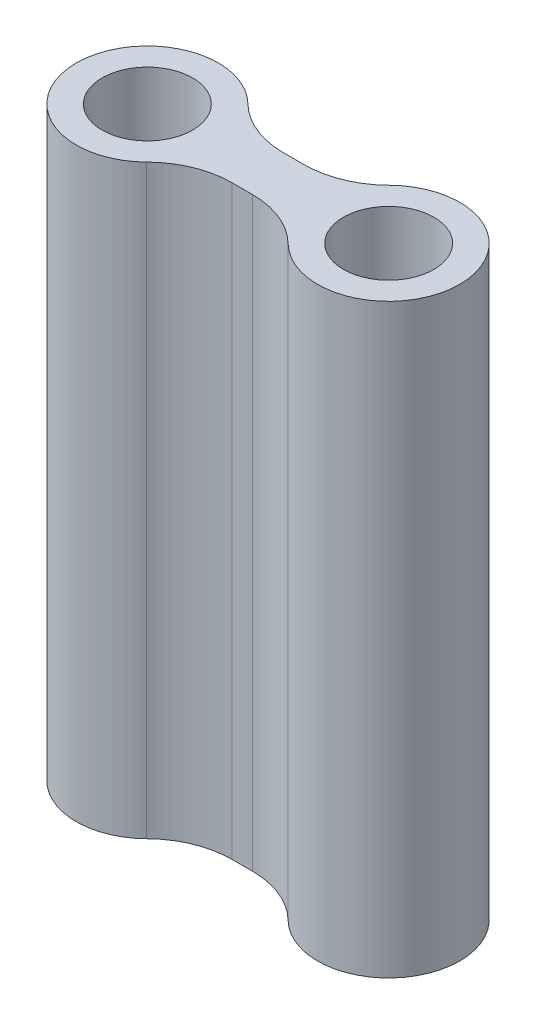
ISO-10303-21;
HEADER;
FILE_DESCRIPTION(('STEP AP214'),'2;1');
FILE_NAME('part.step','',(''),(''),'','','');
FILE_SCHEMA(('AUTOMOTIVE_DESIGN { 1 0 10303 214 1 1 1 1 }'));
ENDSEC;
DATA;
#1=APPLICATION_CONTEXT('core data for automotive mechanical design processes');
#2=APPLICATION_PROTOCOL_DEFINITION('international standard','automotive_design',2000,#1);
#3=PRODUCT_CONTEXT('',#1,'mechanical');
#4=PRODUCT('Part','Part','',(#3));
#5=PRODUCT_RELATED_PRODUCT_CATEGORY('part','',(#4));
#6=PRODUCT_DEFINITION_FORMATION('','',#4);
#7=PRODUCT_DEFINITION_CONTEXT('part definition',#1,'design');
#8=PRODUCT_DEFINITION('design','',#6,#7);
#9=PRODUCT_DEFINITION_SHAPE('','',#8);
#10=(LENGTH_UNIT() NAMED_UNIT(*) SI_UNIT(.MILLI.,.METRE.));
#11=(NAMED_UNIT(*) PLANE_ANGLE_UNIT() SI_UNIT($,.RADIAN.));
#12=(NAMED_UNIT(*) SI_UNIT($,.STERADIAN.) SOLID_ANGLE_UNIT());
#13=UNCERTAINTY_MEASURE_WITH_UNIT(LENGTH_MEASURE(1.E-05),#10,'distance_accuracy_value','');
#14=(GEOMETRIC_REPRESENTATION_CONTEXT(3) GLOBAL_UNCERTAINTY_ASSIGNED_CONTEXT((#13)) GLOBAL_UNIT_ASSIGNED_CONTEXT((#10,
#11,#12)) REPRESENTATION_CONTEXT('',''));
#15=CARTESIAN_POINT('',(0.,0.,0.));
#16=DIRECTION('',(0.,0.,1.));
#17=DIRECTION('',(1.,0.,0.));
#18=AXIS2_PLACEMENT_3D('',#15,#16,#17);
#19=CARTESIAN_POINT('',(-6.40434422872475,34.,6.5));
#20=DIRECTION('',(0.,-1.,0.));
#21=DIRECTION('',(0.,0.,-1.));
#22=AXIS2_PLACEMENT_3D('',#19,#20,#21);
#23=PLANE('',#22);
#24=CARTESIAN_POINT('',(-6.40434422872475,34.,6.5));
#25=DIRECTION('',(0.,-1.,0.));
#26=DIRECTION('',(0.,0.,-1.));
#27=AXIS2_PLACEMENT_3D('',#24,#25,#26);
#28=CIRCLE('',#27,5.);
#29=CARTESIAN_POINT('',(-6.40434422872475,34.,1.5));
#30=VERTEX_POINT('',#29);
#31=CARTESIAN_POINT('',(-2.89511451435503,34.,2.93835616438356));
#32=VERTEX_POINT('',#31);
#33=EDGE_CURVE('E145',#30,#32,#28,.T.);
#34=ORIENTED_EDGE('',*,*,#33,.T.);
#35=CARTESIAN_POINT('',(0.,34.,0.));
#36=DIRECTION('',(0.,1.,0.));
#37=DIRECTION('',(0.,0.,1.));
#38=AXIS2_PLACEMENT_3D('',#35,#36,#37);
#39=CIRCLE('',#38,4.125);
#40=CARTESIAN_POINT('',(-2.89511451435502,34.,-2.93835616438356));
#41=VERTEX_POINT('',#40);
#42=EDGE_CURVE('E93',#32,#41,#39,.T.);
#43=ORIENTED_EDGE('',*,*,#42,.T.);
#44=CARTESIAN_POINT('',(-6.40434422872475,34.,-6.5));
#45=DIRECTION('',(0.,-1.,0.));
#46=DIRECTION('',(0.,0.,1.));
#47=AXIS2_PLACEMENT_3D('',#44,#45,#46);
#48=CIRCLE('',#47,5.);
#49=CARTESIAN_POINT('',(-6.40434422872475,34.,-1.5));
#50=VERTEX_POINT('',#49);
#51=EDGE_CURVE('E160',#41,#50,#48,.T.);
#52=ORIENTED_EDGE('',*,*,#51,.T.);
#53=DIRECTION('',(-1.,0.,0.));
#54=VECTOR('',#53,1.);
#55=CARTESIAN_POINT('',(-7.59565577127525,34.,-1.5));
#56=LINE('',#55,#54);
#57=CARTESIAN_POINT('',(-7.59565577127525,34.,-1.5));
#58=VERTEX_POINT('',#57);
#59=EDGE_CURVE('E173',#50,#58,#56,.T.);
#60=ORIENTED_EDGE('',*,*,#59,.T.);
#61=CARTESIAN_POINT('',(-7.59565577127525,34.,-6.5));
#62=DIRECTION('',(0.,-1.,0.));
#63=DIRECTION('',(0.,0.,-1.));
#64=AXIS2_PLACEMENT_3D('',#61,#62,#63);
#65=CIRCLE('',#64,5.);
#66=CARTESIAN_POINT('',(-11.104885485645,34.,-2.93835616438356));
#67=VERTEX_POINT('',#66);
#68=EDGE_CURVE('E112',#58,#67,#65,.T.);
#69=ORIENTED_EDGE('',*,*,#68,.T.);
#70=CARTESIAN_POINT('',(-14.,34.,0.));
#71=DIRECTION('',(0.,1.,0.));
#72=DIRECTION('',(0.,0.,1.));
#73=AXIS2_PLACEMENT_3D('',#70,#71,#72);
#74=CIRCLE('',#73,4.125);
#75=CARTESIAN_POINT('',(-11.104885485645,34.,2.93835616438356));
#76=VERTEX_POINT('',#75);
#77=EDGE_CURVE('E106',#67,#76,#74,.T.);
#78=ORIENTED_EDGE('',*,*,#77,.T.);
#79=CARTESIAN_POINT('',(-7.59565577127525,34.,6.5));
#80=DIRECTION('',(0.,-1.,0.));
#81=DIRECTION('',(0.,0.,1.));
#82=AXIS2_PLACEMENT_3D('',#79,#80,#81);
#83=CIRCLE('',#82,5.);
#84=CARTESIAN_POINT('',(-7.59565577127525,34.,1.5));
#85=VERTEX_POINT('',#84);
#86=EDGE_CURVE('E110',#76,#85,#83,.T.);
#87=ORIENTED_EDGE('',*,*,#86,.T.);
#88=DIRECTION('',(1.,0.,0.));
#89=VECTOR('',#88,1.);
#90=CARTESIAN_POINT('',(-7.59565577127525,34.,1.5));
#91=LINE('',#90,#89);
#92=EDGE_CURVE('E50',#85,#30,#91,.T.);
#93=ORIENTED_EDGE('',*,*,#92,.T.);
#94=EDGE_LOOP('',(#34,#43,#52,#60,#69,#78,#87,#93));
#95=FACE_BOUND('',#94,.T.);
#96=CARTESIAN_POINT('',(0.,34.,0.));
#97=DIRECTION('',(0.,1.,0.));
#98=DIRECTION('',(0.,0.,1.));
#99=AXIS2_PLACEMENT_3D('',#96,#97,#98);
#100=CIRCLE('',#99,2.625);
#101=CARTESIAN_POINT('',(0.,34.,2.625));
#102=VERTEX_POINT('',#101);
#103=EDGE_CURVE('E134',#102,#102,#100,.T.);
#104=ORIENTED_EDGE('',*,*,#103,.F.);
#105=EDGE_LOOP('',(#104));
#106=FACE_BOUND('',#105,.T.);
#107=CARTESIAN_POINT('',(-14.,34.,0.));
#108=DIRECTION('',(0.,1.,0.));
#109=DIRECTION('',(0.,0.,1.));
#110=AXIS2_PLACEMENT_3D('',#107,#108,#109);
#111=CIRCLE('',#110,2.625);
#112=CARTESIAN_POINT('',(-14.,34.,2.625));
#113=VERTEX_POINT('',#112);
#114=EDGE_CURVE('E182',#113,#113,#111,.T.);
#115=ORIENTED_EDGE('',*,*,#114,.F.);
#116=EDGE_LOOP('',(#115));
#117=FACE_BOUND('',#116,.T.);
#118=ADVANCED_FACE('F33',(#95,#106,#117),#23,.F.);
#119=CARTESIAN_POINT('',(-6.40434422872475,0.,6.5));
#120=DIRECTION('',(0.,-1.,0.));
#121=DIRECTION('',(0.,0.,-1.));
#122=AXIS2_PLACEMENT_3D('',#119,#120,#121);
#123=PLANE('',#122);
#124=CARTESIAN_POINT('',(0.,0.,0.));
#125=DIRECTION('',(0.,1.,0.));
#126=DIRECTION('',(0.,0.,1.));
#127=AXIS2_PLACEMENT_3D('',#124,#125,#126);
#128=CIRCLE('',#127,2.625);
#129=CARTESIAN_POINT('',(0.,0.,2.625));
#130=VERTEX_POINT('',#129);
#131=EDGE_CURVE('E179',#130,#130,#128,.T.);
#132=ORIENTED_EDGE('',*,*,#131,.T.);
#133=EDGE_LOOP('',(#132));
#134=FACE_BOUND('',#133,.T.);
#135=CARTESIAN_POINT('',(-6.40434422872475,0.,6.5));
#136=DIRECTION('',(0.,-1.,0.));
#137=DIRECTION('',(0.,0.,-1.));
#138=AXIS2_PLACEMENT_3D('',#135,#136,#137);
#139=CIRCLE('',#138,5.);
#140=CARTESIAN_POINT('',(-6.40434422872475,0.,1.5));
#141=VERTEX_POINT('',#140);
#142=CARTESIAN_POINT('',(-2.89511451435503,0.,2.93835616438356));
#143=VERTEX_POINT('',#142);
#144=EDGE_CURVE('E130',#141,#143,#139,.T.);
#145=ORIENTED_EDGE('',*,*,#144,.F.);
#146=DIRECTION('',(1.,0.,0.));
#147=VECTOR('',#146,1.);
#148=CARTESIAN_POINT('',(-7.59565577127525,0.,1.5));
#149=LINE('',#148,#147);
#150=CARTESIAN_POINT('',(-7.59565577127525,0.,1.5));
#151=VERTEX_POINT('',#150);
#152=EDGE_CURVE('E85',#151,#141,#149,.T.);
#153=ORIENTED_EDGE('',*,*,#152,.F.);
#154=CARTESIAN_POINT('',(-7.59565577127525,0.,6.5));
#155=DIRECTION('',(0.,-1.,0.));
#156=DIRECTION('',(0.,0.,1.));
#157=AXIS2_PLACEMENT_3D('',#154,#155,#156);
#158=CIRCLE('',#157,5.);
#159=CARTESIAN_POINT('',(-11.104885485645,0.,2.93835616438356));
#160=VERTEX_POINT('',#159);
#161=EDGE_CURVE('E79',#160,#151,#158,.T.);
#162=ORIENTED_EDGE('',*,*,#161,.F.);
#163=CARTESIAN_POINT('',(-14.,0.,0.));
#164=DIRECTION('',(0.,1.,0.));
#165=DIRECTION('',(0.,0.,1.));
#166=AXIS2_PLACEMENT_3D('',#163,#164,#165);
#167=CIRCLE('',#166,4.125);
#168=CARTESIAN_POINT('',(-11.104885485645,0.,-2.93835616438356));
#169=VERTEX_POINT('',#168);
#170=EDGE_CURVE('E120',#169,#160,#167,.T.);
#171=ORIENTED_EDGE('',*,*,#170,.F.);
#172=CARTESIAN_POINT('',(-7.59565577127525,0.,-6.5));
#173=DIRECTION('',(0.,-1.,0.));
#174=DIRECTION('',(0.,0.,-1.));
#175=AXIS2_PLACEMENT_3D('',#172,#173,#174);
#176=CIRCLE('',#175,5.);
#177=CARTESIAN_POINT('',(-7.59565577127525,0.,-1.5));
#178=VERTEX_POINT('',#177);
#179=EDGE_CURVE('E140',#178,#169,#176,.T.);
#180=ORIENTED_EDGE('',*,*,#179,.F.);
#181=DIRECTION('',(-1.,0.,0.));
#182=VECTOR('',#181,1.);
#183=CARTESIAN_POINT('',(-7.59565577127525,0.,-1.5));
#184=LINE('',#183,#182);
#185=CARTESIAN_POINT('',(-6.40434422872475,0.,-1.5));
#186=VERTEX_POINT('',#185);
#187=EDGE_CURVE('E138',#186,#178,#184,.T.);
#188=ORIENTED_EDGE('',*,*,#187,.F.);
#189=CARTESIAN_POINT('',(-6.40434422872475,0.,-6.5));
#190=DIRECTION('',(0.,-1.,0.));
#191=DIRECTION('',(0.,0.,1.));
#192=AXIS2_PLACEMENT_3D('',#189,#190,#191);
#193=CIRCLE('',#192,5.);
#194=CARTESIAN_POINT('',(-2.89511451435502,0.,-2.93835616438356));
#195=VERTEX_POINT('',#194);
#196=EDGE_CURVE('E136',#195,#186,#193,.T.);
#197=ORIENTED_EDGE('',*,*,#196,.F.);
#198=CARTESIAN_POINT('',(0.,0.,0.));
#199=DIRECTION('',(0.,1.,0.));
#200=DIRECTION('',(0.,0.,1.));
#201=AXIS2_PLACEMENT_3D('',#198,#199,#200);
#202=CIRCLE('',#201,4.125);
#203=EDGE_CURVE('E133',#143,#195,#202,.T.);
#204=ORIENTED_EDGE('',*,*,#203,.F.);
#205=EDGE_LOOP('',(#145,#153,#162,#171,#180,#188,#197,#204));
#206=FACE_BOUND('',#205,.T.);
#207=CARTESIAN_POINT('',(-14.,0.,0.));
#208=DIRECTION('',(0.,1.,0.));
#209=DIRECTION('',(0.,0.,1.));
#210=AXIS2_PLACEMENT_3D('',#207,#208,#209);
#211=CIRCLE('',#210,2.625);
#212=CARTESIAN_POINT('',(-14.,0.,2.625));
#213=VERTEX_POINT('',#212);
#214=EDGE_CURVE('E185',#213,#213,#211,.T.);
#215=ORIENTED_EDGE('',*,*,#214,.T.);
#216=EDGE_LOOP('',(#215));
#217=FACE_BOUND('',#216,.T.);
#218=ADVANCED_FACE('F164',(#134,#206,#217),#123,.T.);
#219=CARTESIAN_POINT('',(-6.40434422872475,34.,6.5));
#220=DIRECTION('',(0.,-1.,0.));
#221=DIRECTION('',(0.,0.,-1.));
#222=AXIS2_PLACEMENT_3D('',#219,#220,#221);
#223=CYLINDRICAL_SURFACE('',#222,5.);
#224=ORIENTED_EDGE('',*,*,#144,.T.);
#225=DIRECTION('',(0.,-1.,0.));
#226=VECTOR('',#225,1.);
#227=CARTESIAN_POINT('',(-2.89511451435503,34.,2.93835616438356));
#228=LINE('',#227,#226);
#229=EDGE_CURVE('E11',#32,#143,#228,.T.);
#230=ORIENTED_EDGE('',*,*,#229,.F.);
#231=ORIENTED_EDGE('',*,*,#33,.F.);
#232=DIRECTION('',(0.,-1.,0.));
#233=VECTOR('',#232,1.);
#234=CARTESIAN_POINT('',(-6.40434422872475,34.,1.5));
#235=LINE('',#234,#233);
#236=EDGE_CURVE('E126',#30,#141,#235,.T.);
#237=ORIENTED_EDGE('',*,*,#236,.T.);
#238=EDGE_LOOP('',(#224,#230,#231,#237));
#239=FACE_BOUND('',#238,.T.);
#240=ADVANCED_FACE('F35',(#239),#223,.F.);
#241=CARTESIAN_POINT('',(0.,34.,0.));
#242=DIRECTION('',(0.,-1.,0.));
#243=DIRECTION('',(0.,0.,-1.));
#244=AXIS2_PLACEMENT_3D('',#241,#242,#243);
#245=CYLINDRICAL_SURFACE('',#244,4.125);
#246=ORIENTED_EDGE('',*,*,#203,.T.);
#247=DIRECTION('',(0.,-1.,0.));
#248=VECTOR('',#247,1.);
#249=CARTESIAN_POINT('',(-2.89511451435502,34.,-2.93835616438356));
#250=LINE('',#249,#248);
#251=EDGE_CURVE('E42',#41,#195,#250,.T.);
#252=ORIENTED_EDGE('',*,*,#251,.F.);
#253=ORIENTED_EDGE('',*,*,#42,.F.);
#254=ORIENTED_EDGE('',*,*,#229,.T.);
#255=EDGE_LOOP('',(#246,#252,#253,#254));
#256=FACE_BOUND('',#255,.T.);
#257=ADVANCED_FACE('F217',(#256),#245,.T.);
#258=CARTESIAN_POINT('',(-6.40434422872475,34.,-6.5));
#259=DIRECTION('',(0.,-1.,0.));
#260=DIRECTION('',(0.,0.,-1.));
#261=AXIS2_PLACEMENT_3D('',#258,#259,#260);
#262=CYLINDRICAL_SURFACE('',#261,5.);
#263=ORIENTED_EDGE('',*,*,#196,.T.);
#264=DIRECTION('',(0.,-1.,0.));
#265=VECTOR('',#264,1.);
#266=CARTESIAN_POINT('',(-6.40434422872475,34.,-1.5));
#267=LINE('',#266,#265);
#268=EDGE_CURVE('E152',#50,#186,#267,.T.);
#269=ORIENTED_EDGE('',*,*,#268,.F.);
#270=ORIENTED_EDGE('',*,*,#51,.F.);
#271=ORIENTED_EDGE('',*,*,#251,.T.);
#272=EDGE_LOOP('',(#263,#269,#270,#271));
#273=FACE_BOUND('',#272,.T.);
#274=ADVANCED_FACE('F158',(#273),#262,.F.);
#275=CARTESIAN_POINT('',(-7.59565577127525,34.,-1.5));
#276=DIRECTION('',(0.,0.,1.));
#277=DIRECTION('',(1.,0.,0.));
#278=AXIS2_PLACEMENT_3D('',#275,#276,#277);
#279=PLANE('',#278);
#280=ORIENTED_EDGE('',*,*,#187,.T.);
#281=DIRECTION('',(0.,-1.,0.));
#282=VECTOR('',#281,1.);
#283=CARTESIAN_POINT('',(-7.59565577127525,34.,-1.5));
#284=LINE('',#283,#282);
#285=EDGE_CURVE('E149',#58,#178,#284,.T.);
#286=ORIENTED_EDGE('',*,*,#285,.F.);
#287=ORIENTED_EDGE('',*,*,#59,.F.);
#288=ORIENTED_EDGE('',*,*,#268,.T.);
#289=EDGE_LOOP('',(#280,#286,#287,#288));
#290=FACE_BOUND('',#289,.T.);
#291=ADVANCED_FACE('F169',(#290),#279,.F.);
#292=CARTESIAN_POINT('',(-7.59565577127525,34.,-6.5));
#293=DIRECTION('',(0.,-1.,0.));
#294=DIRECTION('',(0.,0.,-1.));
#295=AXIS2_PLACEMENT_3D('',#292,#293,#294);
#296=CYLINDRICAL_SURFACE('',#295,5.);
#297=ORIENTED_EDGE('',*,*,#179,.T.);
#298=DIRECTION('',(0.,-1.,0.));
#299=VECTOR('',#298,1.);
#300=CARTESIAN_POINT('',(-11.104885485645,34.,-2.93835616438356));
#301=LINE('',#300,#299);
#302=EDGE_CURVE('E121',#67,#169,#301,.T.);
#303=ORIENTED_EDGE('',*,*,#302,.F.);
#304=ORIENTED_EDGE('',*,*,#68,.F.);
#305=ORIENTED_EDGE('',*,*,#285,.T.);
#306=EDGE_LOOP('',(#297,#303,#304,#305));
#307=FACE_BOUND('',#306,.T.);
#308=ADVANCED_FACE('F172',(#307),#296,.F.);
#309=CARTESIAN_POINT('',(-14.,34.,0.));
#310=DIRECTION('',(0.,-1.,0.));
#311=DIRECTION('',(0.,0.,-1.));
#312=AXIS2_PLACEMENT_3D('',#309,#310,#311);
#313=CYLINDRICAL_SURFACE('',#312,4.125);
#314=ORIENTED_EDGE('',*,*,#170,.T.);
#315=DIRECTION('',(0.,-1.,0.));
#316=VECTOR('',#315,1.);
#317=CARTESIAN_POINT('',(-11.104885485645,34.,2.93835616438356));
#318=LINE('',#317,#316);
#319=EDGE_CURVE('E117',#76,#160,#318,.T.);
#320=ORIENTED_EDGE('',*,*,#319,.F.);
#321=ORIENTED_EDGE('',*,*,#77,.F.);
#322=ORIENTED_EDGE('',*,*,#302,.T.);
#323=EDGE_LOOP('',(#314,#320,#321,#322));
#324=FACE_BOUND('',#323,.T.);
#325=ADVANCED_FACE('F118',(#324),#313,.T.);
#326=CARTESIAN_POINT('',(-7.59565577127525,34.,6.5));
#327=DIRECTION('',(0.,-1.,0.));
#328=DIRECTION('',(0.,0.,-1.));
#329=AXIS2_PLACEMENT_3D('',#326,#327,#328);
#330=CYLINDRICAL_SURFACE('',#329,5.);
#331=ORIENTED_EDGE('',*,*,#161,.T.);
#332=DIRECTION('',(0.,-1.,0.));
#333=VECTOR('',#332,1.);
#334=CARTESIAN_POINT('',(-7.59565577127525,34.,1.5));
#335=LINE('',#334,#333);
#336=EDGE_CURVE('E122',#85,#151,#335,.T.);
#337=ORIENTED_EDGE('',*,*,#336,.F.);
#338=ORIENTED_EDGE('',*,*,#86,.F.);
#339=ORIENTED_EDGE('',*,*,#319,.T.);
#340=EDGE_LOOP('',(#331,#337,#338,#339));
#341=FACE_BOUND('',#340,.T.);
#342=ADVANCED_FACE('F124',(#341),#330,.F.);
#343=CARTESIAN_POINT('',(-7.59565577127525,34.,1.5));
#344=DIRECTION('',(0.,0.,-1.));
#345=DIRECTION('',(-1.,0.,0.));
#346=AXIS2_PLACEMENT_3D('',#343,#344,#345);
#347=PLANE('',#346);
#348=ORIENTED_EDGE('',*,*,#152,.T.);
#349=ORIENTED_EDGE('',*,*,#236,.F.);
#350=ORIENTED_EDGE('',*,*,#92,.F.);
#351=ORIENTED_EDGE('',*,*,#336,.T.);
#352=EDGE_LOOP('',(#348,#349,#350,#351));
#353=FACE_BOUND('',#352,.T.);
#354=ADVANCED_FACE('F205',(#353),#347,.F.);
#355=CARTESIAN_POINT('',(0.,34.,0.));
#356=DIRECTION('',(0.,-1.,0.));
#357=DIRECTION('',(0.,0.,-1.));
#358=AXIS2_PLACEMENT_3D('',#355,#356,#357);
#359=CYLINDRICAL_SURFACE('',#358,2.625);
#360=ORIENTED_EDGE('',*,*,#103,.T.);
#361=EDGE_LOOP('',(#360));
#362=FACE_BOUND('',#361,.T.);
#363=ORIENTED_EDGE('',*,*,#131,.F.);
#364=EDGE_LOOP('',(#363));
#365=FACE_BOUND('',#364,.T.);
#366=ADVANCED_FACE('F202',(#362,#365),#359,.F.);
#367=CARTESIAN_POINT('',(-14.,34.,0.));
#368=DIRECTION('',(0.,-1.,0.));
#369=DIRECTION('',(0.,0.,-1.));
#370=AXIS2_PLACEMENT_3D('',#367,#368,#369);
#371=CYLINDRICAL_SURFACE('',#370,2.625);
#372=ORIENTED_EDGE('',*,*,#114,.T.);
#373=EDGE_LOOP('',(#372));
#374=FACE_BOUND('',#373,.T.);
#375=ORIENTED_EDGE('',*,*,#214,.F.);
#376=EDGE_LOOP('',(#375));
#377=FACE_BOUND('',#376,.T.);
#378=ADVANCED_FACE('F191',(#374,#377),#371,.F.);
#379=CLOSED_SHELL('',(#118,#218,#240,#257,#274,#291,#308,#325,#342,#354,#366,#378));
#380=MANIFOLD_SOLID_BREP('B2',#379);
#381=ADVANCED_BREP_SHAPE_REPRESENTATION('',(#18,#380),#14);
#382=SHAPE_DEFINITION_REPRESENTATION(#9,#381);
ENDSEC;
END-ISO-10303-21;
